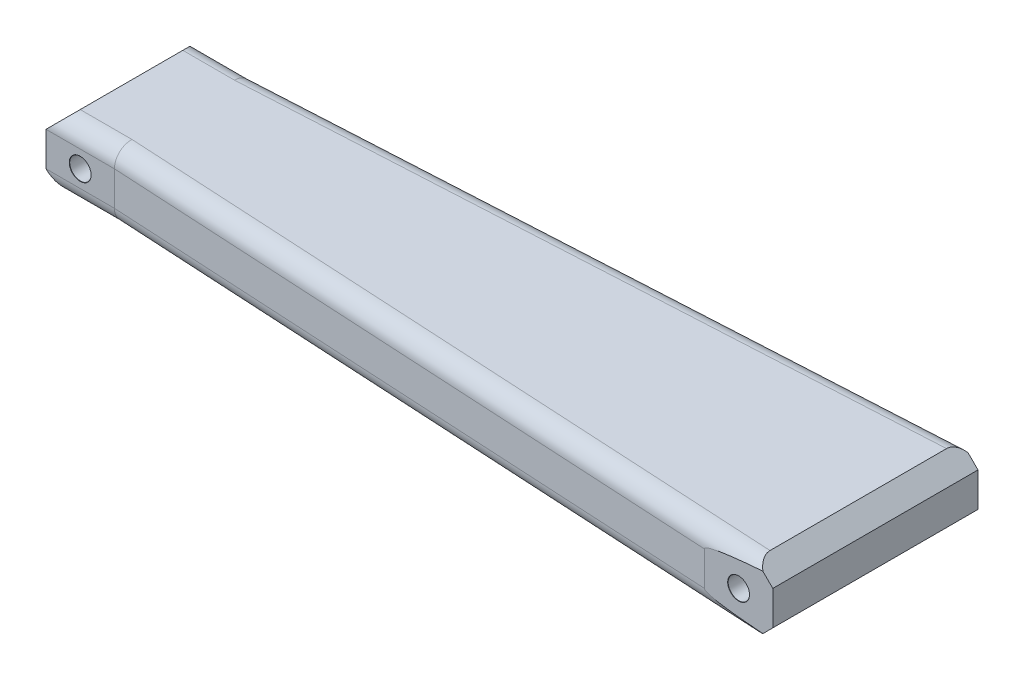
ISO-10303-21;
HEADER;
FILE_DESCRIPTION(('STEP AP214'),'2;1');
FILE_NAME('part.step','',(''),(''),'','','');
FILE_SCHEMA(('AUTOMOTIVE_DESIGN { 1 0 10303 214 1 1 1 1 }'));
ENDSEC;
DATA;
#1=APPLICATION_CONTEXT('core data for automotive mechanical design processes');
#2=APPLICATION_PROTOCOL_DEFINITION('international standard','automotive_design',2000,#1);
#3=PRODUCT_CONTEXT('',#1,'mechanical');
#4=PRODUCT('Part','Part','',(#3));
#5=PRODUCT_RELATED_PRODUCT_CATEGORY('part','',(#4));
#6=PRODUCT_DEFINITION_FORMATION('','',#4);
#7=PRODUCT_DEFINITION_CONTEXT('part definition',#1,'design');
#8=PRODUCT_DEFINITION('design','',#6,#7);
#9=PRODUCT_DEFINITION_SHAPE('','',#8);
#10=(LENGTH_UNIT() NAMED_UNIT(*) SI_UNIT(.MILLI.,.METRE.));
#11=(NAMED_UNIT(*) PLANE_ANGLE_UNIT() SI_UNIT($,.RADIAN.));
#12=(NAMED_UNIT(*) SI_UNIT($,.STERADIAN.) SOLID_ANGLE_UNIT());
#13=UNCERTAINTY_MEASURE_WITH_UNIT(LENGTH_MEASURE(1.E-05),#10,'distance_accuracy_value','');
#14=(GEOMETRIC_REPRESENTATION_CONTEXT(3) GLOBAL_UNCERTAINTY_ASSIGNED_CONTEXT((#13)) GLOBAL_UNIT_ASSIGNED_CONTEXT((#10,
#11,#12)) REPRESENTATION_CONTEXT('',''));
#15=CARTESIAN_POINT('',(0.,0.,0.));
#16=DIRECTION('',(0.,0.,1.));
#17=DIRECTION('',(1.,0.,0.));
#18=AXIS2_PLACEMENT_3D('',#15,#16,#17);
#19=CARTESIAN_POINT('',(4.,4.,8.));
#20=DIRECTION('',(0.0547124467021418,0.,-0.998502152314088));
#21=DIRECTION('',(-0.998502152314088,0.,-0.0547124467021418));
#22=AXIS2_PLACEMENT_3D('',#19,#20,#21);
#23=PLANE('',#22);
#24=DIRECTION('',(0.,-1.,0.));
#25=VECTOR('',#24,1.);
#26=CARTESIAN_POINT('',(4.,4.,8.));
#27=LINE('',#26,#25);
#28=CARTESIAN_POINT('',(4.,2.,8.));
#29=VERTEX_POINT('',#28);
#30=CARTESIAN_POINT('',(4.,-2.,8.));
#31=VERTEX_POINT('',#30);
#32=EDGE_CURVE('E403',#29,#31,#27,.T.);
#33=ORIENTED_EDGE('',*,*,#32,.T.);
#34=DIRECTION('',(0.998502152314088,0.,0.0547124467021418));
#35=VECTOR('',#34,1.);
#36=CARTESIAN_POINT('',(77.,-2.,12.));
#37=LINE('',#36,#35);
#38=CARTESIAN_POINT('',(77.,-2.,12.));
#39=VERTEX_POINT('',#38);
#40=EDGE_CURVE('E59',#31,#39,#37,.T.);
#41=ORIENTED_EDGE('',*,*,#40,.T.);
#42=DIRECTION('',(0.,-1.,0.));
#43=VECTOR('',#42,1.);
#44=CARTESIAN_POINT('',(77.,4.,12.));
#45=LINE('',#44,#43);
#46=CARTESIAN_POINT('',(77.,2.,12.));
#47=VERTEX_POINT('',#46);
#48=EDGE_CURVE('E187',#47,#39,#45,.T.);
#49=ORIENTED_EDGE('',*,*,#48,.F.);
#50=DIRECTION('',(0.998502152314088,0.,0.0547124467021418));
#51=VECTOR('',#50,1.);
#52=CARTESIAN_POINT('',(4.,2.,8.));
#53=LINE('',#52,#51);
#54=EDGE_CURVE('E301',#47,#29,#53,.F.);
#55=ORIENTED_EDGE('',*,*,#54,.T.);
#56=EDGE_LOOP('',(#33,#41,#49,#55));
#57=FACE_BOUND('',#56,.T.);
#58=ADVANCED_FACE('F41',(#57),#23,.F.);
#59=CARTESIAN_POINT('',(77.,4.,12.));
#60=DIRECTION('',(0.,0.,-1.));
#61=DIRECTION('',(-1.,0.,0.));
#62=AXIS2_PLACEMENT_3D('',#59,#60,#61);
#63=PLANE('',#62);
#64=CARTESIAN_POINT('',(81.,0.,12.));
#65=DIRECTION('',(0.,0.,1.));
#66=DIRECTION('',(1.,0.,0.));
#67=AXIS2_PLACEMENT_3D('',#64,#65,#66);
#68=CIRCLE('',#67,1.275);
#69=CARTESIAN_POINT('',(82.275,0.,12.));
#70=VERTEX_POINT('',#69);
#71=EDGE_CURVE('E421',#70,#70,#68,.T.);
#72=ORIENTED_EDGE('',*,*,#71,.F.);
#73=EDGE_LOOP('',(#72));
#74=FACE_BOUND('',#73,.T.);
#75=ORIENTED_EDGE('',*,*,#48,.T.);
#76=CARTESIAN_POINT('',(113.554753452868,-2.,12.));
#77=DIRECTION('',(0.,0.,-1.));
#78=DIRECTION('',(-1.,0.,0.));
#79=AXIS2_PLACEMENT_3D('',#76,#77,#78);
#80=ELLIPSE('',#79,36.5547534528683,2.);
#81=CARTESIAN_POINT('',(83.8354915257694,-3.16450847423056,12.));
#82=VERTEX_POINT('',#81);
#83=EDGE_CURVE('E11',#39,#82,#80,.F.);
#84=ORIENTED_EDGE('',*,*,#83,.T.);
#85=DIRECTION('',(0.707106781186549,0.707106781186546,0.));
#86=VECTOR('',#85,1.);
#87=CARTESIAN_POINT('',(85.,-1.99999999999999,12.));
#88=LINE('',#87,#86);
#89=CARTESIAN_POINT('',(85.,-1.99999999999998,12.));
#90=VERTEX_POINT('',#89);
#91=EDGE_CURVE('E207',#82,#90,#88,.T.);
#92=ORIENTED_EDGE('',*,*,#91,.T.);
#93=DIRECTION('',(0.,-1.,0.));
#94=VECTOR('',#93,1.);
#95=CARTESIAN_POINT('',(85.,4.,12.));
#96=LINE('',#95,#94);
#97=CARTESIAN_POINT('',(85.,2.,12.));
#98=VERTEX_POINT('',#97);
#99=EDGE_CURVE('E180',#98,#90,#96,.T.);
#100=ORIENTED_EDGE('',*,*,#99,.F.);
#101=DIRECTION('',(0.707106781186541,-0.707106781186554,0.));
#102=VECTOR('',#101,1.);
#103=CARTESIAN_POINT('',(83.,4.,12.));
#104=LINE('',#103,#102);
#105=CARTESIAN_POINT('',(83.8354915257695,3.16450847423058,12.));
#106=VERTEX_POINT('',#105);
#107=EDGE_CURVE('E185',#98,#106,#104,.F.);
#108=ORIENTED_EDGE('',*,*,#107,.T.);
#109=CARTESIAN_POINT('',(113.554753452868,2.,12.));
#110=DIRECTION('',(0.,0.,-1.));
#111=DIRECTION('',(1.,0.,0.));
#112=AXIS2_PLACEMENT_3D('',#109,#110,#111);
#113=ELLIPSE('',#112,36.5547534528683,2.);
#114=EDGE_CURVE('E51',#106,#47,#113,.F.);
#115=ORIENTED_EDGE('',*,*,#114,.T.);
#116=EDGE_LOOP('',(#75,#84,#92,#100,#108,#115));
#117=FACE_BOUND('',#116,.T.);
#118=ADVANCED_FACE('F451',(#74,#117),#63,.F.);
#119=CARTESIAN_POINT('',(85.,4.,-12.));
#120=DIRECTION('',(-1.,0.,0.));
#121=DIRECTION('',(0.,0.,1.));
#122=AXIS2_PLACEMENT_3D('',#119,#120,#121);
#123=PLANE('',#122);
#124=ORIENTED_EDGE('',*,*,#99,.T.);
#125=DIRECTION('',(0.,0.,-1.));
#126=VECTOR('',#125,1.);
#127=CARTESIAN_POINT('',(85.,-1.99999999999998,-12.));
#128=LINE('',#127,#126);
#129=CARTESIAN_POINT('',(85.,-1.99999999999998,-12.));
#130=VERTEX_POINT('',#129);
#131=EDGE_CURVE('E170',#90,#130,#128,.T.);
#132=ORIENTED_EDGE('',*,*,#131,.T.);
#133=DIRECTION('',(0.,-1.,0.));
#134=VECTOR('',#133,1.);
#135=CARTESIAN_POINT('',(85.,4.,-12.));
#136=LINE('',#135,#134);
#137=CARTESIAN_POINT('',(85.,2.,-12.));
#138=VERTEX_POINT('',#137);
#139=EDGE_CURVE('E161',#138,#130,#136,.T.);
#140=ORIENTED_EDGE('',*,*,#139,.F.);
#141=DIRECTION('',(0.,0.,1.));
#142=VECTOR('',#141,1.);
#143=CARTESIAN_POINT('',(85.,2.,-12.));
#144=LINE('',#143,#142);
#145=EDGE_CURVE('E176',#138,#98,#144,.T.);
#146=ORIENTED_EDGE('',*,*,#145,.T.);
#147=EDGE_LOOP('',(#124,#132,#140,#146));
#148=FACE_BOUND('',#147,.T.);
#149=ADVANCED_FACE('F175',(#148),#123,.F.);
#150=CARTESIAN_POINT('',(77.,4.,-12.));
#151=DIRECTION('',(0.,0.,1.));
#152=DIRECTION('',(1.,0.,0.));
#153=AXIS2_PLACEMENT_3D('',#150,#151,#152);
#154=PLANE('',#153);
#155=CARTESIAN_POINT('',(81.,0.,-12.));
#156=DIRECTION('',(0.,0.,-1.));
#157=DIRECTION('',(-1.,0.,0.));
#158=AXIS2_PLACEMENT_3D('',#155,#156,#157);
#159=CIRCLE('',#158,1.275);
#160=CARTESIAN_POINT('',(79.725,0.,-12.));
#161=VERTEX_POINT('',#160);
#162=EDGE_CURVE('E312',#161,#161,#159,.T.);
#163=ORIENTED_EDGE('',*,*,#162,.F.);
#164=EDGE_LOOP('',(#163));
#165=FACE_BOUND('',#164,.T.);
#166=DIRECTION('',(-0.707106781186549,-0.707106781186546,0.));
#167=VECTOR('',#166,1.);
#168=CARTESIAN_POINT('',(85.,-1.99999999999998,-12.));
#169=LINE('',#168,#167);
#170=CARTESIAN_POINT('',(83.8354915257694,-3.16450847423056,-12.));
#171=VERTEX_POINT('',#170);
#172=EDGE_CURVE('E169',#130,#171,#169,.T.);
#173=ORIENTED_EDGE('',*,*,#172,.T.);
#174=CARTESIAN_POINT('',(113.554753452869,-2.,-12.));
#175=DIRECTION('',(0.,0.,1.));
#176=DIRECTION('',(1.,0.,0.));
#177=AXIS2_PLACEMENT_3D('',#174,#175,#176);
#178=ELLIPSE('',#177,36.5547534528686,2.);
#179=CARTESIAN_POINT('',(77.,-2.,-12.));
#180=VERTEX_POINT('',#179);
#181=EDGE_CURVE('E292',#171,#180,#178,.F.);
#182=ORIENTED_EDGE('',*,*,#181,.T.);
#183=DIRECTION('',(0.,-1.,0.));
#184=VECTOR('',#183,1.);
#185=CARTESIAN_POINT('',(77.,4.,-12.));
#186=LINE('',#185,#184);
#187=CARTESIAN_POINT('',(77.,2.,-12.));
#188=VERTEX_POINT('',#187);
#189=EDGE_CURVE('E181',#188,#180,#186,.T.);
#190=ORIENTED_EDGE('',*,*,#189,.F.);
#191=CARTESIAN_POINT('',(113.554753452869,2.,-12.));
#192=DIRECTION('',(0.,0.,1.));
#193=DIRECTION('',(-1.,0.,0.));
#194=AXIS2_PLACEMENT_3D('',#191,#192,#193);
#195=ELLIPSE('',#194,36.5547534528686,2.);
#196=CARTESIAN_POINT('',(83.8354915257694,3.16450847423059,-12.));
#197=VERTEX_POINT('',#196);
#198=EDGE_CURVE('E164',#188,#197,#195,.F.);
#199=ORIENTED_EDGE('',*,*,#198,.T.);
#200=DIRECTION('',(-0.707106781186541,0.707106781186554,0.));
#201=VECTOR('',#200,1.);
#202=CARTESIAN_POINT('',(83.,4.,-12.));
#203=LINE('',#202,#201);
#204=EDGE_CURVE('E157',#197,#138,#203,.F.);
#205=ORIENTED_EDGE('',*,*,#204,.T.);
#206=ORIENTED_EDGE('',*,*,#139,.T.);
#207=EDGE_LOOP('',(#173,#182,#190,#199,#205,#206));
#208=FACE_BOUND('',#207,.T.);
#209=ADVANCED_FACE('F160',(#165,#208),#154,.F.);
#210=CARTESIAN_POINT('',(4.,4.,-8.));
#211=DIRECTION('',(0.0547124467021418,0.,0.998502152314088));
#212=DIRECTION('',(0.998502152314088,0.,-0.0547124467021418));
#213=AXIS2_PLACEMENT_3D('',#210,#211,#212);
#214=PLANE('',#213);
#215=ORIENTED_EDGE('',*,*,#189,.T.);
#216=DIRECTION('',(-0.998502152314088,0.,0.0547124467021418));
#217=VECTOR('',#216,1.);
#218=CARTESIAN_POINT('',(4.,-2.,-8.));
#219=LINE('',#218,#217);
#220=CARTESIAN_POINT('',(4.,-2.,-8.));
#221=VERTEX_POINT('',#220);
#222=EDGE_CURVE('E281',#180,#221,#219,.T.);
#223=ORIENTED_EDGE('',*,*,#222,.T.);
#224=DIRECTION('',(0.,-1.,0.));
#225=VECTOR('',#224,1.);
#226=CARTESIAN_POINT('',(4.,4.,-8.));
#227=LINE('',#226,#225);
#228=CARTESIAN_POINT('',(4.,2.,-8.));
#229=VERTEX_POINT('',#228);
#230=EDGE_CURVE('E357',#229,#221,#227,.T.);
#231=ORIENTED_EDGE('',*,*,#230,.F.);
#232=DIRECTION('',(-0.998502152314088,0.,0.0547124467021418));
#233=VECTOR('',#232,1.);
#234=CARTESIAN_POINT('',(4.,2.,-8.));
#235=LINE('',#234,#233);
#236=EDGE_CURVE('E278',#229,#188,#235,.F.);
#237=ORIENTED_EDGE('',*,*,#236,.T.);
#238=EDGE_LOOP('',(#215,#223,#231,#237));
#239=FACE_BOUND('',#238,.T.);
#240=ADVANCED_FACE('F368',(#239),#214,.F.);
#241=CARTESIAN_POINT('',(-4.,4.,-8.));
#242=DIRECTION('',(0.,0.,1.));
#243=DIRECTION('',(1.,0.,0.));
#244=AXIS2_PLACEMENT_3D('',#241,#242,#243);
#245=PLANE('',#244);
#246=CARTESIAN_POINT('',(0.,0.,-8.00000000000001));
#247=DIRECTION('',(0.,0.,-1.));
#248=DIRECTION('',(-1.,0.,0.));
#249=AXIS2_PLACEMENT_3D('',#246,#247,#248);
#250=CIRCLE('',#249,1.275);
#251=CARTESIAN_POINT('',(-1.275,0.,-8.00000000000001));
#252=VERTEX_POINT('',#251);
#253=EDGE_CURVE('E429',#252,#252,#250,.T.);
#254=ORIENTED_EDGE('',*,*,#253,.F.);
#255=EDGE_LOOP('',(#254));
#256=FACE_BOUND('',#255,.T.);
#257=ORIENTED_EDGE('',*,*,#230,.T.);
#258=DIRECTION('',(-1.,0.,0.));
#259=VECTOR('',#258,1.);
#260=CARTESIAN_POINT('',(-2.,-2.,-8.));
#261=LINE('',#260,#259);
#262=CARTESIAN_POINT('',(-4.,-2.00000000000001,-8.));
#263=VERTEX_POINT('',#262);
#264=EDGE_CURVE('E229',#221,#263,#261,.T.);
#265=ORIENTED_EDGE('',*,*,#264,.T.);
#266=DIRECTION('',(0.,-1.,0.));
#267=VECTOR('',#266,1.);
#268=CARTESIAN_POINT('',(-4.,4.,-8.));
#269=LINE('',#268,#267);
#270=CARTESIAN_POINT('',(-4.,2.,-8.));
#271=VERTEX_POINT('',#270);
#272=EDGE_CURVE('E346',#271,#263,#269,.T.);
#273=ORIENTED_EDGE('',*,*,#272,.F.);
#274=DIRECTION('',(-1.,0.,0.));
#275=VECTOR('',#274,1.);
#276=CARTESIAN_POINT('',(-4.,2.,-8.));
#277=LINE('',#276,#275);
#278=EDGE_CURVE('E226',#271,#229,#277,.F.);
#279=ORIENTED_EDGE('',*,*,#278,.T.);
#280=EDGE_LOOP('',(#257,#265,#273,#279));
#281=FACE_BOUND('',#280,.T.);
#282=ADVANCED_FACE('F353',(#256,#281),#245,.F.);
#283=CARTESIAN_POINT('',(-3.99999999999999,4.,8.));
#284=DIRECTION('',(1.,0.,0.));
#285=DIRECTION('',(0.,0.,-1.));
#286=AXIS2_PLACEMENT_3D('',#283,#284,#285);
#287=PLANE('',#286);
#288=ORIENTED_EDGE('',*,*,#272,.T.);
#289=DIRECTION('',(0.,0.,1.));
#290=VECTOR('',#289,1.);
#291=CARTESIAN_POINT('',(-3.99999999999999,-2.00000000000001,8.));
#292=LINE('',#291,#290);
#293=CARTESIAN_POINT('',(-3.99999999999999,-2.00000000000001,8.));
#294=VERTEX_POINT('',#293);
#295=EDGE_CURVE('E222',#263,#294,#292,.T.);
#296=ORIENTED_EDGE('',*,*,#295,.T.);
#297=DIRECTION('',(0.,-1.,0.));
#298=VECTOR('',#297,1.);
#299=CARTESIAN_POINT('',(-3.99999999999999,4.,8.));
#300=LINE('',#299,#298);
#301=CARTESIAN_POINT('',(-3.99999999999999,2.,8.));
#302=VERTEX_POINT('',#301);
#303=EDGE_CURVE('E349',#302,#294,#300,.T.);
#304=ORIENTED_EDGE('',*,*,#303,.F.);
#305=DIRECTION('',(0.,0.,-1.));
#306=VECTOR('',#305,1.);
#307=CARTESIAN_POINT('',(-3.99999999999999,2.,8.));
#308=LINE('',#307,#306);
#309=EDGE_CURVE('E218',#302,#271,#308,.T.);
#310=ORIENTED_EDGE('',*,*,#309,.T.);
#311=EDGE_LOOP('',(#288,#296,#304,#310));
#312=FACE_BOUND('',#311,.T.);
#313=ADVANCED_FACE('F345',(#312),#287,.F.);
#314=CARTESIAN_POINT('',(-3.99999999999999,4.,8.));
#315=DIRECTION('',(0.,0.,-1.));
#316=DIRECTION('',(-1.,0.,0.));
#317=AXIS2_PLACEMENT_3D('',#314,#315,#316);
#318=PLANE('',#317);
#319=CARTESIAN_POINT('',(0.,0.,8.00000000000001));
#320=DIRECTION('',(0.,0.,1.));
#321=DIRECTION('',(1.,0.,0.));
#322=AXIS2_PLACEMENT_3D('',#319,#320,#321);
#323=CIRCLE('',#322,1.275);
#324=CARTESIAN_POINT('',(1.275,0.,8.00000000000001));
#325=VERTEX_POINT('',#324);
#326=EDGE_CURVE('E411',#325,#325,#323,.T.);
#327=ORIENTED_EDGE('',*,*,#326,.F.);
#328=EDGE_LOOP('',(#327));
#329=FACE_BOUND('',#328,.T.);
#330=ORIENTED_EDGE('',*,*,#303,.T.);
#331=DIRECTION('',(1.,0.,0.));
#332=VECTOR('',#331,1.);
#333=CARTESIAN_POINT('',(4.,-2.,8.));
#334=LINE('',#333,#332);
#335=EDGE_CURVE('E274',#294,#31,#334,.T.);
#336=ORIENTED_EDGE('',*,*,#335,.T.);
#337=ORIENTED_EDGE('',*,*,#32,.F.);
#338=DIRECTION('',(1.,0.,0.));
#339=VECTOR('',#338,1.);
#340=CARTESIAN_POINT('',(-3.99999999999999,2.,8.));
#341=LINE('',#340,#339);
#342=EDGE_CURVE('E271',#29,#302,#341,.F.);
#343=ORIENTED_EDGE('',*,*,#342,.T.);
#344=EDGE_LOOP('',(#330,#336,#337,#343));
#345=FACE_BOUND('',#344,.T.);
#346=ADVANCED_FACE('F402',(#329,#345),#318,.F.);
#347=CARTESIAN_POINT('',(0.,4.,0.));
#348=DIRECTION('',(0.,-1.,0.));
#349=DIRECTION('',(0.,0.,-1.));
#350=AXIS2_PLACEMENT_3D('',#347,#348,#349);
#351=PLANE('',#350);
#352=DIRECTION('',(-0.998502152314088,0.,0.0547124467021418));
#353=VECTOR('',#352,1.);
#354=CARTESIAN_POINT('',(-0.315645265622845,4.,-5.76052609761692));
#355=LINE('',#354,#353);
#356=CARTESIAN_POINT('',(83.,4.,-10.3257669340894));
#357=VERTEX_POINT('',#356);
#358=CARTESIAN_POINT('',(4.05475345286848,4.,-6.));
#359=VERTEX_POINT('',#358);
#360=EDGE_CURVE('E258',#357,#359,#355,.T.);
#361=ORIENTED_EDGE('',*,*,#360,.T.);
#362=DIRECTION('',(-1.,0.,0.));
#363=VECTOR('',#362,1.);
#364=CARTESIAN_POINT('',(0.,4.,-6.));
#365=LINE('',#364,#363);
#366=CARTESIAN_POINT('',(-2.,4.,-6.));
#367=VERTEX_POINT('',#366);
#368=EDGE_CURVE('E261',#359,#367,#365,.T.);
#369=ORIENTED_EDGE('',*,*,#368,.T.);
#370=DIRECTION('',(0.,0.,1.));
#371=VECTOR('',#370,1.);
#372=CARTESIAN_POINT('',(-1.99999999999999,4.,0.));
#373=LINE('',#372,#371);
#374=CARTESIAN_POINT('',(-1.99999999999999,4.,6.));
#375=VERTEX_POINT('',#374);
#376=EDGE_CURVE('E210',#367,#375,#373,.T.);
#377=ORIENTED_EDGE('',*,*,#376,.T.);
#378=DIRECTION('',(1.,0.,0.));
#379=VECTOR('',#378,1.);
#380=CARTESIAN_POINT('',(0.,4.,6.));
#381=LINE('',#380,#379);
#382=CARTESIAN_POINT('',(4.05475345286847,4.,6.));
#383=VERTEX_POINT('',#382);
#384=EDGE_CURVE('E254',#375,#383,#381,.T.);
#385=ORIENTED_EDGE('',*,*,#384,.T.);
#386=DIRECTION('',(0.998502152314088,0.,0.0547124467021418));
#387=VECTOR('',#386,1.);
#388=CARTESIAN_POINT('',(-0.315645265622845,4.,5.76052609761692));
#389=LINE('',#388,#387);
#390=CARTESIAN_POINT('',(83.,4.,10.3257669340894));
#391=VERTEX_POINT('',#390);
#392=EDGE_CURVE('E251',#383,#391,#389,.T.);
#393=ORIENTED_EDGE('',*,*,#392,.T.);
#394=DIRECTION('',(0.,0.,-1.));
#395=VECTOR('',#394,1.);
#396=CARTESIAN_POINT('',(83.,4.,0.));
#397=LINE('',#396,#395);
#398=EDGE_CURVE('E214',#391,#357,#397,.T.);
#399=ORIENTED_EDGE('',*,*,#398,.T.);
#400=EDGE_LOOP('',(#361,#369,#377,#385,#393,#399));
#401=FACE_BOUND('',#400,.T.);
#402=ADVANCED_FACE('F335',(#401),#351,.F.);
#403=CARTESIAN_POINT('',(0.,-4.,0.));
#404=DIRECTION('',(0.,-1.,0.));
#405=DIRECTION('',(0.,0.,-1.));
#406=AXIS2_PLACEMENT_3D('',#403,#404,#405);
#407=PLANE('',#406);
#408=DIRECTION('',(0.,0.,-1.));
#409=VECTOR('',#408,1.);
#410=CARTESIAN_POINT('',(-2.,-4.,-8.));
#411=LINE('',#410,#409);
#412=CARTESIAN_POINT('',(-1.99999999999999,-4.,6.));
#413=VERTEX_POINT('',#412);
#414=CARTESIAN_POINT('',(-2.,-4.,-6.));
#415=VERTEX_POINT('',#414);
#416=EDGE_CURVE('E197',#413,#415,#411,.T.);
#417=ORIENTED_EDGE('',*,*,#416,.T.);
#418=DIRECTION('',(-1.,0.,0.));
#419=VECTOR('',#418,1.);
#420=CARTESIAN_POINT('',(4.,-4.,-6.));
#421=LINE('',#420,#419);
#422=CARTESIAN_POINT('',(4.05475345286848,-4.,-6.));
#423=VERTEX_POINT('',#422);
#424=EDGE_CURVE('E248',#415,#423,#421,.F.);
#425=ORIENTED_EDGE('',*,*,#424,.T.);
#426=DIRECTION('',(-0.998502152314088,0.,0.0547124467021418));
#427=VECTOR('',#426,1.);
#428=CARTESIAN_POINT('',(77.1094248934043,-4.,-10.0029956953718));
#429=LINE('',#428,#427);
#430=CARTESIAN_POINT('',(83.,-4.,-10.3257669340894));
#431=VERTEX_POINT('',#430);
#432=EDGE_CURVE('E245',#423,#431,#429,.F.);
#433=ORIENTED_EDGE('',*,*,#432,.T.);
#434=DIRECTION('',(0.,0.,1.));
#435=VECTOR('',#434,1.);
#436=CARTESIAN_POINT('',(83.,-4.,12.));
#437=LINE('',#436,#435);
#438=CARTESIAN_POINT('',(83.,-4.,10.3257669340894));
#439=VERTEX_POINT('',#438);
#440=EDGE_CURVE('E201',#431,#439,#437,.T.);
#441=ORIENTED_EDGE('',*,*,#440,.T.);
#442=DIRECTION('',(0.998502152314088,0.,0.0547124467021418));
#443=VECTOR('',#442,1.);
#444=CARTESIAN_POINT('',(4.10942489340429,-4.,6.00299569537183));
#445=LINE('',#444,#443);
#446=CARTESIAN_POINT('',(4.05475345286848,-4.,6.));
#447=VERTEX_POINT('',#446);
#448=EDGE_CURVE('E239',#439,#447,#445,.F.);
#449=ORIENTED_EDGE('',*,*,#448,.T.);
#450=DIRECTION('',(1.,0.,0.));
#451=VECTOR('',#450,1.);
#452=CARTESIAN_POINT('',(-1.99999999999999,-4.,6.));
#453=LINE('',#452,#451);
#454=EDGE_CURVE('E242',#447,#413,#453,.F.);
#455=ORIENTED_EDGE('',*,*,#454,.T.);
#456=EDGE_LOOP('',(#417,#425,#433,#441,#449,#455));
#457=FACE_BOUND('',#456,.T.);
#458=ADVANCED_FACE('F394',(#457),#407,.T.);
#459=CARTESIAN_POINT('',(0.,0.,8.));
#460=DIRECTION('',(0.,0.,1.));
#461=DIRECTION('',(1.,0.,0.));
#462=AXIS2_PLACEMENT_3D('',#459,#460,#461);
#463=CYLINDRICAL_SURFACE('',#462,1.25);
#464=CARTESIAN_POINT('',(0.,0.,7.975));
#465=DIRECTION('',(0.,0.,1.));
#466=DIRECTION('',(1.,0.,0.));
#467=AXIS2_PLACEMENT_3D('',#464,#465,#466);
#468=CIRCLE('',#467,1.25);
#469=CARTESIAN_POINT('',(1.25,0.,7.975));
#470=VERTEX_POINT('',#469);
#471=EDGE_CURVE('E405',#470,#470,#468,.T.);
#472=ORIENTED_EDGE('',*,*,#471,.T.);
#473=EDGE_LOOP('',(#472));
#474=FACE_BOUND('',#473,.T.);
#475=CARTESIAN_POINT('',(0.,0.,-7.975));
#476=DIRECTION('',(0.,0.,-1.));
#477=DIRECTION('',(-1.,0.,0.));
#478=AXIS2_PLACEMENT_3D('',#475,#476,#477);
#479=CIRCLE('',#478,1.25);
#480=CARTESIAN_POINT('',(-1.25,0.,-7.975));
#481=VERTEX_POINT('',#480);
#482=EDGE_CURVE('E425',#481,#481,#479,.T.);
#483=ORIENTED_EDGE('',*,*,#482,.T.);
#484=EDGE_LOOP('',(#483));
#485=FACE_BOUND('',#484,.T.);
#486=ADVANCED_FACE('F586',(#474,#485),#463,.F.);
#487=CARTESIAN_POINT('',(0.,0.,8.00000000000001));
#488=DIRECTION('',(0.,0.,1.));
#489=DIRECTION('',(1.,0.,0.));
#490=AXIS2_PLACEMENT_3D('',#487,#488,#489);
#491=CONICAL_SURFACE('',#490,1.275,0.785398163397401);
#492=ORIENTED_EDGE('',*,*,#471,.F.);
#493=EDGE_LOOP('',(#492));
#494=FACE_BOUND('',#493,.T.);
#495=ORIENTED_EDGE('',*,*,#326,.T.);
#496=EDGE_LOOP('',(#495));
#497=FACE_BOUND('',#496,.T.);
#498=ADVANCED_FACE('F579',(#494,#497),#491,.F.);
#499=CARTESIAN_POINT('',(81.,0.,12.));
#500=DIRECTION('',(0.,0.,1.));
#501=DIRECTION('',(1.,0.,0.));
#502=AXIS2_PLACEMENT_3D('',#499,#500,#501);
#503=CYLINDRICAL_SURFACE('',#502,1.24999999999999);
#504=CARTESIAN_POINT('',(81.,0.,11.975));
#505=DIRECTION('',(0.,0.,1.));
#506=DIRECTION('',(1.,0.,0.));
#507=AXIS2_PLACEMENT_3D('',#504,#505,#506);
#508=CIRCLE('',#507,1.24999999999999);
#509=CARTESIAN_POINT('',(82.25,0.,11.975));
#510=VERTEX_POINT('',#509);
#511=EDGE_CURVE('E417',#510,#510,#508,.T.);
#512=ORIENTED_EDGE('',*,*,#511,.T.);
#513=EDGE_LOOP('',(#512));
#514=FACE_BOUND('',#513,.T.);
#515=CARTESIAN_POINT('',(81.,0.,-11.975));
#516=DIRECTION('',(0.,0.,-1.));
#517=DIRECTION('',(-1.,0.,0.));
#518=AXIS2_PLACEMENT_3D('',#515,#516,#517);
#519=CIRCLE('',#518,1.24999999999999);
#520=CARTESIAN_POINT('',(79.75,0.,-11.975));
#521=VERTEX_POINT('',#520);
#522=EDGE_CURVE('E433',#521,#521,#519,.T.);
#523=ORIENTED_EDGE('',*,*,#522,.T.);
#524=EDGE_LOOP('',(#523));
#525=FACE_BOUND('',#524,.T.);
#526=ADVANCED_FACE('F570',(#514,#525),#503,.F.);
#527=CARTESIAN_POINT('',(81.,0.,12.));
#528=DIRECTION('',(0.,0.,1.));
#529=DIRECTION('',(1.,0.,0.));
#530=AXIS2_PLACEMENT_3D('',#527,#528,#529);
#531=CONICAL_SURFACE('',#530,1.275,0.785398163397969);
#532=ORIENTED_EDGE('',*,*,#511,.F.);
#533=EDGE_LOOP('',(#532));
#534=FACE_BOUND('',#533,.T.);
#535=ORIENTED_EDGE('',*,*,#71,.T.);
#536=EDGE_LOOP('',(#535));
#537=FACE_BOUND('',#536,.T.);
#538=ADVANCED_FACE('F561',(#534,#537),#531,.F.);
#539=CARTESIAN_POINT('',(0.,0.,-8.00000000000001));
#540=DIRECTION('',(0.,0.,-1.));
#541=DIRECTION('',(-1.,0.,0.));
#542=AXIS2_PLACEMENT_3D('',#539,#540,#541);
#543=CONICAL_SURFACE('',#542,1.275,0.785398163397401);
#544=ORIENTED_EDGE('',*,*,#482,.F.);
#545=EDGE_LOOP('',(#544));
#546=FACE_BOUND('',#545,.T.);
#547=ORIENTED_EDGE('',*,*,#253,.T.);
#548=EDGE_LOOP('',(#547));
#549=FACE_BOUND('',#548,.T.);
#550=ADVANCED_FACE('F554',(#546,#549),#543,.F.);
#551=CARTESIAN_POINT('',(81.,0.,-12.));
#552=DIRECTION('',(0.,0.,-1.));
#553=DIRECTION('',(-1.,0.,0.));
#554=AXIS2_PLACEMENT_3D('',#551,#552,#553);
#555=CONICAL_SURFACE('',#554,1.275,0.785398163397969);
#556=ORIENTED_EDGE('',*,*,#522,.F.);
#557=EDGE_LOOP('',(#556));
#558=FACE_BOUND('',#557,.T.);
#559=ORIENTED_EDGE('',*,*,#162,.T.);
#560=EDGE_LOOP('',(#559));
#561=FACE_BOUND('',#560,.T.);
#562=ADVANCED_FACE('F441',(#558,#561),#555,.F.);
#563=CARTESIAN_POINT('',(85.,-1.99999999999998,-12.));
#564=DIRECTION('',(0.707106781186546,-0.707106781186549,0.));
#565=DIRECTION('',(0.,0.,1.));
#566=AXIS2_PLACEMENT_3D('',#563,#564,#565);
#567=PLANE('',#566);
#568=ORIENTED_EDGE('',*,*,#440,.F.);
#569=CARTESIAN_POINT('',(85.,-2.,-10.4353559751853));
#570=DIRECTION('',(0.707106781186546,-0.707106781186549,0.));
#571=DIRECTION('',(0.704993249745103,0.7049932497451,-0.0772595342186407));
#572=AXIS2_PLACEMENT_3D('',#569,#570,#571);
#573=ELLIPSE('',#572,2.83267003300008,2.);
#574=EDGE_CURVE('E287',#431,#171,#573,.T.);
#575=ORIENTED_EDGE('',*,*,#574,.T.);
#576=ORIENTED_EDGE('',*,*,#172,.F.);
#577=ORIENTED_EDGE('',*,*,#131,.F.);
#578=ORIENTED_EDGE('',*,*,#91,.F.);
#579=CARTESIAN_POINT('',(85.,-2.,10.4353559751853));
#580=DIRECTION('',(0.707106781186546,-0.707106781186549,0.));
#581=DIRECTION('',(-0.704993249745103,-0.7049932497451,-0.0772595342186415));
#582=AXIS2_PLACEMENT_3D('',#579,#580,#581);
#583=ELLIPSE('',#582,2.83267003300008,2.);
#584=EDGE_CURVE('E284',#82,#439,#583,.T.);
#585=ORIENTED_EDGE('',*,*,#584,.T.);
#586=EDGE_LOOP('',(#568,#575,#576,#577,#578,#585));
#587=FACE_BOUND('',#586,.T.);
#588=ADVANCED_FACE('F379',(#587),#567,.T.);
#589=CARTESIAN_POINT('',(83.,4.,0.));
#590=DIRECTION('',(-0.707106781186554,-0.707106781186541,0.));
#591=DIRECTION('',(0.,0.,-1.));
#592=AXIS2_PLACEMENT_3D('',#589,#590,#591);
#593=PLANE('',#592);
#594=ORIENTED_EDGE('',*,*,#204,.F.);
#595=CARTESIAN_POINT('',(85.,2.,-10.4353559751853));
#596=DIRECTION('',(-0.707106781186554,-0.707106781186541,0.));
#597=DIRECTION('',(-0.704993249745096,0.704993249745108,0.0772595342186415));
#598=AXIS2_PLACEMENT_3D('',#595,#596,#597);
#599=ELLIPSE('',#598,2.83267003300005,2.);
#600=EDGE_CURVE('E298',#197,#357,#599,.F.);
#601=ORIENTED_EDGE('',*,*,#600,.T.);
#602=ORIENTED_EDGE('',*,*,#398,.F.);
#603=CARTESIAN_POINT('',(85.,2.,10.4353559751853));
#604=DIRECTION('',(-0.707106781186554,-0.707106781186541,0.));
#605=DIRECTION('',(0.704993249745096,-0.704993249745108,0.0772595342186423));
#606=AXIS2_PLACEMENT_3D('',#603,#604,#605);
#607=ELLIPSE('',#606,2.83267003300005,2.);
#608=EDGE_CURVE('E295',#391,#106,#607,.F.);
#609=ORIENTED_EDGE('',*,*,#608,.T.);
#610=ORIENTED_EDGE('',*,*,#107,.F.);
#611=ORIENTED_EDGE('',*,*,#145,.F.);
#612=EDGE_LOOP('',(#594,#601,#602,#609,#610,#611));
#613=FACE_BOUND('',#612,.T.);
#614=ADVANCED_FACE('F184',(#613),#593,.F.);
#615=CARTESIAN_POINT('',(-3.99999999999999,-2.00000000000001,8.));
#616=DIRECTION('',(-0.707106781186545,-0.70710678118655,0.));
#617=DIRECTION('',(0.,0.,-1.));
#618=AXIS2_PLACEMENT_3D('',#615,#616,#617);
#619=PLANE('',#618);
#620=ORIENTED_EDGE('',*,*,#295,.F.);
#621=CARTESIAN_POINT('',(-4.00000000000001,-2.,-6.));
#622=DIRECTION('',(-0.707106781186545,-0.70710678118655,0.));
#623=DIRECTION('',(0.70710678118655,-0.707106781186545,0.));
#624=AXIS2_PLACEMENT_3D('',#621,#622,#623);
#625=ELLIPSE('',#624,2.8284271247462,2.);
#626=EDGE_CURVE('E236',#263,#415,#625,.T.);
#627=ORIENTED_EDGE('',*,*,#626,.T.);
#628=ORIENTED_EDGE('',*,*,#416,.F.);
#629=CARTESIAN_POINT('',(-4.00000000000001,-2.,6.));
#630=DIRECTION('',(-0.707106781186545,-0.70710678118655,0.));
#631=DIRECTION('',(-0.70710678118655,0.707106781186545,0.));
#632=AXIS2_PLACEMENT_3D('',#629,#630,#631);
#633=ELLIPSE('',#632,2.8284271247462,2.);
#634=EDGE_CURVE('E233',#413,#294,#633,.T.);
#635=ORIENTED_EDGE('',*,*,#634,.T.);
#636=EDGE_LOOP('',(#620,#627,#628,#635));
#637=FACE_BOUND('',#636,.T.);
#638=ADVANCED_FACE('F391',(#637),#619,.T.);
#639=CARTESIAN_POINT('',(-1.99999999999999,4.,0.));
#640=DIRECTION('',(0.707106781186547,-0.707106781186547,0.));
#641=DIRECTION('',(0.,0.,1.));
#642=AXIS2_PLACEMENT_3D('',#639,#640,#641);
#643=PLANE('',#642);
#644=ORIENTED_EDGE('',*,*,#376,.F.);
#645=CARTESIAN_POINT('',(-4.,2.,-6.));
#646=DIRECTION('',(0.707106781186547,-0.707106781186547,0.));
#647=DIRECTION('',(-0.707106781186548,-0.707106781186548,0.));
#648=AXIS2_PLACEMENT_3D('',#645,#646,#647);
#649=ELLIPSE('',#648,2.82842712474619,2.);
#650=EDGE_CURVE('E268',#367,#271,#649,.F.);
#651=ORIENTED_EDGE('',*,*,#650,.T.);
#652=ORIENTED_EDGE('',*,*,#309,.F.);
#653=CARTESIAN_POINT('',(-3.99999999999999,2.,6.));
#654=DIRECTION('',(0.707106781186547,-0.707106781186547,0.));
#655=DIRECTION('',(0.707106781186548,0.707106781186548,0.));
#656=AXIS2_PLACEMENT_3D('',#653,#654,#655);
#657=ELLIPSE('',#656,2.82842712474619,2.);
#658=EDGE_CURVE('E265',#302,#375,#657,.F.);
#659=ORIENTED_EDGE('',*,*,#658,.T.);
#660=EDGE_LOOP('',(#644,#651,#652,#659));
#661=FACE_BOUND('',#660,.T.);
#662=ADVANCED_FACE('F339',(#661),#643,.F.);
#663=CARTESIAN_POINT('',(4.10942489340429,-2.,-6.00299569537183));
#664=DIRECTION('',(0.998502152314088,0.,-0.0547124467021418));
#665=DIRECTION('',(-0.0547124467021418,0.,-0.998502152314088));
#666=AXIS2_PLACEMENT_3D('',#663,#664,#665);
#667=CYLINDRICAL_SURFACE('',#666,2.);
#668=ORIENTED_EDGE('',*,*,#574,.F.);
#669=ORIENTED_EDGE('',*,*,#432,.F.);
#670=CARTESIAN_POINT('',(4.05475345286802,-2.,-5.99999999999999));
#671=DIRECTION('',(0.99962546794139,0.,-0.0273664729725303));
#672=DIRECTION('',(0.027366472972528,0.,0.99962546794139));
#673=AXIS2_PLACEMENT_3D('',#670,#671,#672);
#674=ELLIPSE('',#673,2.00074934477086,2.);
#675=EDGE_CURVE('E308',#221,#423,#674,.F.);
#676=ORIENTED_EDGE('',*,*,#675,.F.);
#677=ORIENTED_EDGE('',*,*,#222,.F.);
#678=ORIENTED_EDGE('',*,*,#181,.F.);
#679=EDGE_LOOP('',(#668,#669,#676,#677,#678));
#680=FACE_BOUND('',#679,.T.);
#681=ADVANCED_FACE('F383',(#680),#667,.T.);
#682=CARTESIAN_POINT('',(-4.,-2.,-6.));
#683=DIRECTION('',(1.,0.,0.));
#684=DIRECTION('',(0.,0.,-1.));
#685=AXIS2_PLACEMENT_3D('',#682,#683,#684);
#686=CYLINDRICAL_SURFACE('',#685,2.);
#687=ORIENTED_EDGE('',*,*,#675,.T.);
#688=ORIENTED_EDGE('',*,*,#424,.F.);
#689=ORIENTED_EDGE('',*,*,#626,.F.);
#690=ORIENTED_EDGE('',*,*,#264,.F.);
#691=EDGE_LOOP('',(#687,#688,#689,#690));
#692=FACE_BOUND('',#691,.T.);
#693=ADVANCED_FACE('F388',(#692),#686,.T.);
#694=CARTESIAN_POINT('',(-0.315645265622845,2.,-5.76052609761692));
#695=DIRECTION('',(-0.998502152314088,0.,0.0547124467021418));
#696=DIRECTION('',(0.0547124467021418,0.,0.998502152314088));
#697=AXIS2_PLACEMENT_3D('',#694,#695,#696);
#698=CYLINDRICAL_SURFACE('',#697,2.);
#699=ORIENTED_EDGE('',*,*,#198,.F.);
#700=ORIENTED_EDGE('',*,*,#236,.F.);
#701=CARTESIAN_POINT('',(4.0547534528685,2.,-6.));
#702=DIRECTION('',(-0.99962546794139,0.,0.0273664729725303));
#703=DIRECTION('',(-0.027366472972528,0.,-0.99962546794139));
#704=AXIS2_PLACEMENT_3D('',#701,#702,#703);
#705=ELLIPSE('',#704,2.00074934477086,2.);
#706=EDGE_CURVE('E313',#359,#229,#705,.T.);
#707=ORIENTED_EDGE('',*,*,#706,.F.);
#708=ORIENTED_EDGE('',*,*,#360,.F.);
#709=ORIENTED_EDGE('',*,*,#600,.F.);
#710=EDGE_LOOP('',(#699,#700,#707,#708,#709));
#711=FACE_BOUND('',#710,.T.);
#712=ADVANCED_FACE('F365',(#711),#698,.T.);
#713=CARTESIAN_POINT('',(0.,2.,-6.));
#714=DIRECTION('',(-1.,0.,0.));
#715=DIRECTION('',(0.,0.,1.));
#716=AXIS2_PLACEMENT_3D('',#713,#714,#715);
#717=CYLINDRICAL_SURFACE('',#716,2.);
#718=ORIENTED_EDGE('',*,*,#706,.T.);
#719=ORIENTED_EDGE('',*,*,#278,.F.);
#720=ORIENTED_EDGE('',*,*,#650,.F.);
#721=ORIENTED_EDGE('',*,*,#368,.F.);
#722=EDGE_LOOP('',(#718,#719,#720,#721));
#723=FACE_BOUND('',#722,.T.);
#724=ADVANCED_FACE('F360',(#723),#717,.T.);
#725=CARTESIAN_POINT('',(4.10942489340429,-2.,6.00299569537183));
#726=DIRECTION('',(-0.998502152314088,0.,-0.0547124467021418));
#727=DIRECTION('',(-0.0547124467021418,0.,0.998502152314088));
#728=AXIS2_PLACEMENT_3D('',#725,#726,#727);
#729=CYLINDRICAL_SURFACE('',#728,2.);
#730=ORIENTED_EDGE('',*,*,#83,.F.);
#731=ORIENTED_EDGE('',*,*,#40,.F.);
#732=CARTESIAN_POINT('',(4.05475345286789,-2.,5.99999999999999));
#733=DIRECTION('',(-0.99962546794139,0.,-0.0273664729725301));
#734=DIRECTION('',(-0.0273664729725278,0.,0.999625467941391));
#735=AXIS2_PLACEMENT_3D('',#732,#733,#734);
#736=ELLIPSE('',#735,2.00074934477086,2.);
#737=EDGE_CURVE('E316',#447,#31,#736,.T.);
#738=ORIENTED_EDGE('',*,*,#737,.F.);
#739=ORIENTED_EDGE('',*,*,#448,.F.);
#740=ORIENTED_EDGE('',*,*,#584,.F.);
#741=EDGE_LOOP('',(#730,#731,#738,#739,#740));
#742=FACE_BOUND('',#741,.T.);
#743=ADVANCED_FACE('F399',(#742),#729,.T.);
#744=CARTESIAN_POINT('',(-3.99999999999999,-2.,6.));
#745=DIRECTION('',(-1.,0.,0.));
#746=DIRECTION('',(0.,0.,1.));
#747=AXIS2_PLACEMENT_3D('',#744,#745,#746);
#748=CYLINDRICAL_SURFACE('',#747,2.);
#749=ORIENTED_EDGE('',*,*,#634,.F.);
#750=ORIENTED_EDGE('',*,*,#454,.F.);
#751=ORIENTED_EDGE('',*,*,#737,.T.);
#752=ORIENTED_EDGE('',*,*,#335,.F.);
#753=EDGE_LOOP('',(#749,#750,#751,#752));
#754=FACE_BOUND('',#753,.T.);
#755=ADVANCED_FACE('F396',(#754),#748,.T.);
#756=CARTESIAN_POINT('',(-0.315645265622845,2.,5.76052609761692));
#757=DIRECTION('',(0.998502152314088,0.,0.0547124467021418));
#758=DIRECTION('',(0.0547124467021418,0.,-0.998502152314088));
#759=AXIS2_PLACEMENT_3D('',#756,#757,#758);
#760=CYLINDRICAL_SURFACE('',#759,2.);
#761=ORIENTED_EDGE('',*,*,#608,.F.);
#762=ORIENTED_EDGE('',*,*,#392,.F.);
#763=CARTESIAN_POINT('',(4.05475345286849,2.,6.));
#764=DIRECTION('',(0.99962546794139,0.,0.0273664729725301));
#765=DIRECTION('',(0.0273664729725278,0.,-0.999625467941391));
#766=AXIS2_PLACEMENT_3D('',#763,#764,#765);
#767=ELLIPSE('',#766,2.00074934477086,2.);
#768=EDGE_CURVE('E45',#29,#383,#767,.F.);
#769=ORIENTED_EDGE('',*,*,#768,.F.);
#770=ORIENTED_EDGE('',*,*,#54,.F.);
#771=ORIENTED_EDGE('',*,*,#114,.F.);
#772=EDGE_LOOP('',(#761,#762,#769,#770,#771));
#773=FACE_BOUND('',#772,.T.);
#774=ADVANCED_FACE('F43',(#773),#760,.T.);
#775=CARTESIAN_POINT('',(0.,2.,6.));
#776=DIRECTION('',(1.,0.,0.));
#777=DIRECTION('',(0.,0.,-1.));
#778=AXIS2_PLACEMENT_3D('',#775,#776,#777);
#779=CYLINDRICAL_SURFACE('',#778,2.);
#780=ORIENTED_EDGE('',*,*,#658,.F.);
#781=ORIENTED_EDGE('',*,*,#342,.F.);
#782=ORIENTED_EDGE('',*,*,#768,.T.);
#783=ORIENTED_EDGE('',*,*,#384,.F.);
#784=EDGE_LOOP('',(#780,#781,#782,#783));
#785=FACE_BOUND('',#784,.T.);
#786=ADVANCED_FACE('F329',(#785),#779,.T.);
#787=CLOSED_SHELL('',(#58,#118,#149,#209,#240,#282,#313,#346,#402,#458,#486,#498,#526,#538,#550,
#562,#588,#614,#638,#662,#681,#693,#712,#724,#743,#755,#774,#786));
#788=MANIFOLD_SOLID_BREP('B2',#787);
#789=ADVANCED_BREP_SHAPE_REPRESENTATION('',(#18,#788),#14);
#790=SHAPE_DEFINITION_REPRESENTATION(#9,#789);
ENDSEC;
END-ISO-10303-21;
